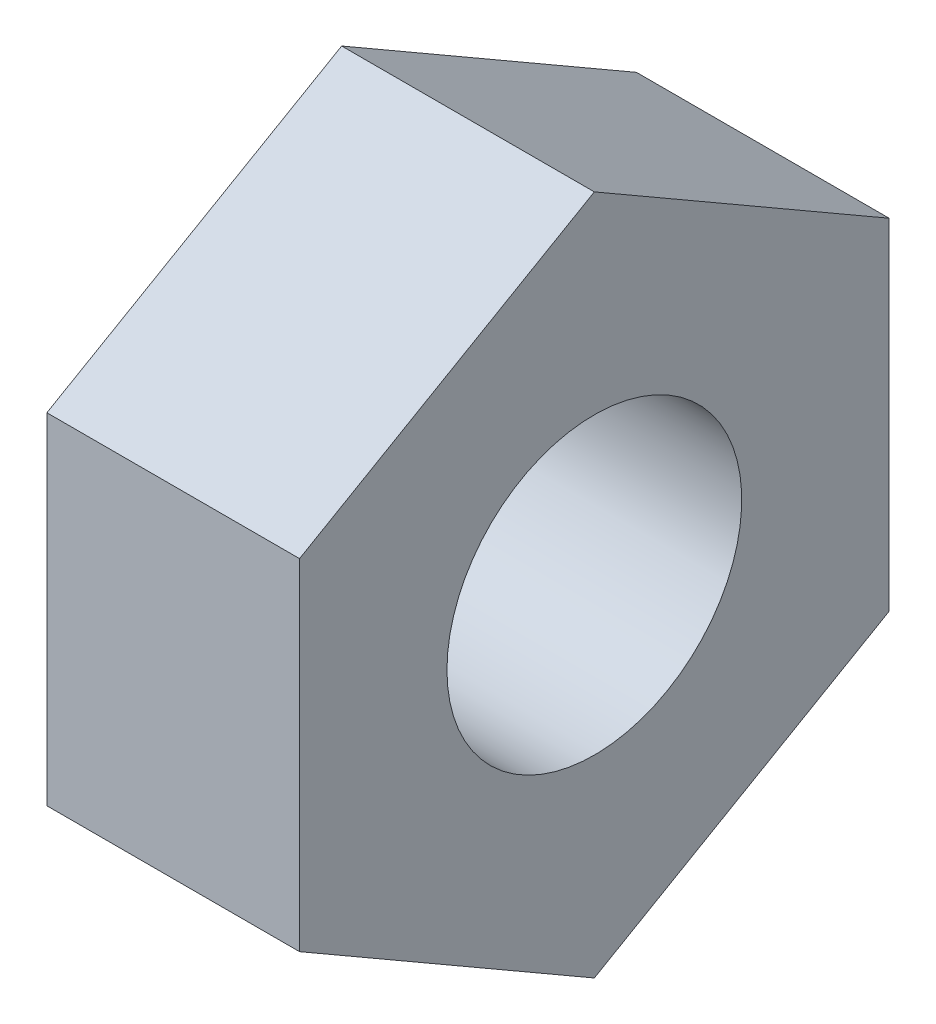
ISO-10303-21;
HEADER;
FILE_DESCRIPTION(('STEP AP214'),'2;1');
FILE_NAME('part.step','',(''),(''),'','','');
FILE_SCHEMA(('AUTOMOTIVE_DESIGN { 1 0 10303 214 1 1 1 1 }'));
ENDSEC;
DATA;
#1=APPLICATION_CONTEXT('core data for automotive mechanical design processes');
#2=APPLICATION_PROTOCOL_DEFINITION('international standard','automotive_design',2000,#1);
#3=PRODUCT_CONTEXT('',#1,'mechanical');
#4=PRODUCT('Part','Part','',(#3));
#5=PRODUCT_RELATED_PRODUCT_CATEGORY('part','',(#4));
#6=PRODUCT_DEFINITION_FORMATION('','',#4);
#7=PRODUCT_DEFINITION_CONTEXT('part definition',#1,'design');
#8=PRODUCT_DEFINITION('design','',#6,#7);
#9=PRODUCT_DEFINITION_SHAPE('','',#8);
#10=(LENGTH_UNIT() NAMED_UNIT(*) SI_UNIT(.MILLI.,.METRE.));
#11=(NAMED_UNIT(*) PLANE_ANGLE_UNIT() SI_UNIT($,.RADIAN.));
#12=(NAMED_UNIT(*) SI_UNIT($,.STERADIAN.) SOLID_ANGLE_UNIT());
#13=UNCERTAINTY_MEASURE_WITH_UNIT(LENGTH_MEASURE(1.E-05),#10,'distance_accuracy_value','');
#14=(GEOMETRIC_REPRESENTATION_CONTEXT(3) GLOBAL_UNCERTAINTY_ASSIGNED_CONTEXT((#13)) GLOBAL_UNIT_ASSIGNED_CONTEXT((#10,
#11,#12)) REPRESENTATION_CONTEXT('',''));
#15=CARTESIAN_POINT('',(0.,0.,0.));
#16=DIRECTION('',(0.,0.,1.));
#17=DIRECTION('',(1.,0.,0.));
#18=AXIS2_PLACEMENT_3D('',#15,#16,#17);
#19=CARTESIAN_POINT('',(3.,-4.04145188432738,0.));
#20=DIRECTION('',(0.,0.866025403784439,0.5));
#21=DIRECTION('',(0.,-0.5,0.866025403784439));
#22=AXIS2_PLACEMENT_3D('',#19,#20,#21);
#23=PLANE('',#22);
#24=DIRECTION('',(0.,0.5,-0.866025403784439));
#25=VECTOR('',#24,1.);
#26=CARTESIAN_POINT('',(0.,-4.04145188432738,0.));
#27=LINE('',#26,#25);
#28=CARTESIAN_POINT('',(0.,-4.04145188432738,0.));
#29=VERTEX_POINT('',#28);
#30=CARTESIAN_POINT('',(0.,-2.02072594216369,-3.5));
#31=VERTEX_POINT('',#30);
#32=EDGE_CURVE('E118',#29,#31,#27,.T.);
#33=ORIENTED_EDGE('',*,*,#32,.T.);
#34=DIRECTION('',(-1.,0.,0.));
#35=VECTOR('',#34,1.);
#36=CARTESIAN_POINT('',(3.,-2.02072594216369,-3.5));
#37=LINE('',#36,#35);
#38=CARTESIAN_POINT('',(3.,-2.02072594216369,-3.5));
#39=VERTEX_POINT('',#38);
#40=EDGE_CURVE('E11',#39,#31,#37,.T.);
#41=ORIENTED_EDGE('',*,*,#40,.F.);
#42=DIRECTION('',(0.,0.5,-0.866025403784439));
#43=VECTOR('',#42,1.);
#44=CARTESIAN_POINT('',(3.,-4.04145188432738,0.));
#45=LINE('',#44,#43);
#46=CARTESIAN_POINT('',(3.,-4.04145188432738,0.));
#47=VERTEX_POINT('',#46);
#48=EDGE_CURVE('E129',#47,#39,#45,.T.);
#49=ORIENTED_EDGE('',*,*,#48,.F.);
#50=DIRECTION('',(-1.,0.,0.));
#51=VECTOR('',#50,1.);
#52=CARTESIAN_POINT('',(3.,-4.04145188432738,0.));
#53=LINE('',#52,#51);
#54=EDGE_CURVE('E114',#47,#29,#53,.T.);
#55=ORIENTED_EDGE('',*,*,#54,.T.);
#56=EDGE_LOOP('',(#33,#41,#49,#55));
#57=FACE_BOUND('',#56,.T.);
#58=ADVANCED_FACE('F34',(#57),#23,.F.);
#59=CARTESIAN_POINT('',(3.,-2.02072594216369,-3.5));
#60=DIRECTION('',(0.,0.,1.));
#61=DIRECTION('',(0.,-1.,0.));
#62=AXIS2_PLACEMENT_3D('',#59,#60,#61);
#63=PLANE('',#62);
#64=DIRECTION('',(0.,1.,0.));
#65=VECTOR('',#64,1.);
#66=CARTESIAN_POINT('',(0.,-2.02072594216369,-3.5));
#67=LINE('',#66,#65);
#68=CARTESIAN_POINT('',(0.,2.02072594216369,-3.5));
#69=VERTEX_POINT('',#68);
#70=EDGE_CURVE('E121',#31,#69,#67,.T.);
#71=ORIENTED_EDGE('',*,*,#70,.T.);
#72=DIRECTION('',(-1.,0.,0.));
#73=VECTOR('',#72,1.);
#74=CARTESIAN_POINT('',(3.,2.02072594216369,-3.5));
#75=LINE('',#74,#73);
#76=CARTESIAN_POINT('',(3.,2.02072594216369,-3.5));
#77=VERTEX_POINT('',#76);
#78=EDGE_CURVE('E42',#77,#69,#75,.T.);
#79=ORIENTED_EDGE('',*,*,#78,.F.);
#80=DIRECTION('',(0.,1.,0.));
#81=VECTOR('',#80,1.);
#82=CARTESIAN_POINT('',(3.,-2.02072594216369,-3.5));
#83=LINE('',#82,#81);
#84=EDGE_CURVE('E87',#39,#77,#83,.T.);
#85=ORIENTED_EDGE('',*,*,#84,.F.);
#86=ORIENTED_EDGE('',*,*,#40,.T.);
#87=EDGE_LOOP('',(#71,#79,#85,#86));
#88=FACE_BOUND('',#87,.T.);
#89=ADVANCED_FACE('F154',(#88),#63,.F.);
#90=CARTESIAN_POINT('',(3.,2.02072594216369,-3.5));
#91=DIRECTION('',(0.,-0.866025403784439,0.5));
#92=DIRECTION('',(0.,-0.5,-0.866025403784439));
#93=AXIS2_PLACEMENT_3D('',#90,#91,#92);
#94=PLANE('',#93);
#95=DIRECTION('',(0.,0.5,0.866025403784439));
#96=VECTOR('',#95,1.);
#97=CARTESIAN_POINT('',(0.,2.02072594216369,-3.5));
#98=LINE('',#97,#96);
#99=CARTESIAN_POINT('',(0.,4.04145188432738,0.));
#100=VERTEX_POINT('',#99);
#101=EDGE_CURVE('E124',#69,#100,#98,.T.);
#102=ORIENTED_EDGE('',*,*,#101,.T.);
#103=DIRECTION('',(-1.,0.,0.));
#104=VECTOR('',#103,1.);
#105=CARTESIAN_POINT('',(3.,4.04145188432738,0.));
#106=LINE('',#105,#104);
#107=CARTESIAN_POINT('',(3.,4.04145188432738,0.));
#108=VERTEX_POINT('',#107);
#109=EDGE_CURVE('E109',#108,#100,#106,.T.);
#110=ORIENTED_EDGE('',*,*,#109,.F.);
#111=DIRECTION('',(0.,0.5,0.866025403784439));
#112=VECTOR('',#111,1.);
#113=CARTESIAN_POINT('',(3.,2.02072594216369,-3.5));
#114=LINE('',#113,#112);
#115=EDGE_CURVE('E100',#77,#108,#114,.T.);
#116=ORIENTED_EDGE('',*,*,#115,.F.);
#117=ORIENTED_EDGE('',*,*,#78,.T.);
#118=EDGE_LOOP('',(#102,#110,#116,#117));
#119=FACE_BOUND('',#118,.T.);
#120=ADVANCED_FACE('F135',(#119),#94,.F.);
#121=CARTESIAN_POINT('',(3.,4.04145188432738,0.));
#122=DIRECTION('',(0.,-0.866025403784439,-0.5));
#123=DIRECTION('',(0.,0.5,-0.866025403784439));
#124=AXIS2_PLACEMENT_3D('',#121,#122,#123);
#125=PLANE('',#124);
#126=DIRECTION('',(0.,-0.5,0.866025403784439));
#127=VECTOR('',#126,1.);
#128=CARTESIAN_POINT('',(0.,4.04145188432738,0.));
#129=LINE('',#128,#127);
#130=CARTESIAN_POINT('',(0.,2.02072594216369,3.5));
#131=VERTEX_POINT('',#130);
#132=EDGE_CURVE('E108',#100,#131,#129,.T.);
#133=ORIENTED_EDGE('',*,*,#132,.T.);
#134=DIRECTION('',(-1.,0.,0.));
#135=VECTOR('',#134,1.);
#136=CARTESIAN_POINT('',(3.,2.02072594216369,3.5));
#137=LINE('',#136,#135);
#138=CARTESIAN_POINT('',(3.,2.02072594216369,3.5));
#139=VERTEX_POINT('',#138);
#140=EDGE_CURVE('E105',#139,#131,#137,.T.);
#141=ORIENTED_EDGE('',*,*,#140,.F.);
#142=DIRECTION('',(0.,-0.5,0.866025403784439));
#143=VECTOR('',#142,1.);
#144=CARTESIAN_POINT('',(3.,4.04145188432738,0.));
#145=LINE('',#144,#143);
#146=EDGE_CURVE('E94',#108,#139,#145,.T.);
#147=ORIENTED_EDGE('',*,*,#146,.F.);
#148=ORIENTED_EDGE('',*,*,#109,.T.);
#149=EDGE_LOOP('',(#133,#141,#147,#148));
#150=FACE_BOUND('',#149,.T.);
#151=ADVANCED_FACE('F106',(#150),#125,.F.);
#152=CARTESIAN_POINT('',(3.,2.02072594216369,3.5));
#153=DIRECTION('',(0.,0.,-1.));
#154=DIRECTION('',(-1.,0.,0.));
#155=AXIS2_PLACEMENT_3D('',#152,#153,#154);
#156=PLANE('',#155);
#157=DIRECTION('',(0.,-1.,0.));
#158=VECTOR('',#157,1.);
#159=CARTESIAN_POINT('',(0.,2.02072594216369,3.5));
#160=LINE('',#159,#158);
#161=CARTESIAN_POINT('',(0.,-2.02072594216369,3.5));
#162=VERTEX_POINT('',#161);
#163=EDGE_CURVE('E73',#131,#162,#160,.T.);
#164=ORIENTED_EDGE('',*,*,#163,.T.);
#165=DIRECTION('',(-1.,0.,0.));
#166=VECTOR('',#165,1.);
#167=CARTESIAN_POINT('',(3.,-2.02072594216369,3.5));
#168=LINE('',#167,#166);
#169=CARTESIAN_POINT('',(3.,-2.02072594216369,3.5));
#170=VERTEX_POINT('',#169);
#171=EDGE_CURVE('E110',#170,#162,#168,.T.);
#172=ORIENTED_EDGE('',*,*,#171,.F.);
#173=DIRECTION('',(0.,-1.,0.));
#174=VECTOR('',#173,1.);
#175=CARTESIAN_POINT('',(3.,2.02072594216369,3.5));
#176=LINE('',#175,#174);
#177=EDGE_CURVE('E98',#139,#170,#176,.T.);
#178=ORIENTED_EDGE('',*,*,#177,.F.);
#179=ORIENTED_EDGE('',*,*,#140,.T.);
#180=EDGE_LOOP('',(#164,#172,#178,#179));
#181=FACE_BOUND('',#180,.T.);
#182=ADVANCED_FACE('F112',(#181),#156,.F.);
#183=CARTESIAN_POINT('',(3.,-2.02072594216369,3.5));
#184=DIRECTION('',(0.,0.866025403784438,-0.5));
#185=DIRECTION('',(0.,0.5,0.866025403784439));
#186=AXIS2_PLACEMENT_3D('',#183,#184,#185);
#187=PLANE('',#186);
#188=DIRECTION('',(0.,-0.5,-0.866025403784439));
#189=VECTOR('',#188,1.);
#190=CARTESIAN_POINT('',(0.,-2.02072594216369,3.5));
#191=LINE('',#190,#189);
#192=EDGE_CURVE('E79',#162,#29,#191,.T.);
#193=ORIENTED_EDGE('',*,*,#192,.T.);
#194=ORIENTED_EDGE('',*,*,#54,.F.);
#195=DIRECTION('',(0.,-0.5,-0.866025403784439));
#196=VECTOR('',#195,1.);
#197=CARTESIAN_POINT('',(3.,-2.02072594216369,3.5));
#198=LINE('',#197,#196);
#199=EDGE_CURVE('E50',#170,#47,#198,.T.);
#200=ORIENTED_EDGE('',*,*,#199,.F.);
#201=ORIENTED_EDGE('',*,*,#171,.T.);
#202=EDGE_LOOP('',(#193,#194,#200,#201));
#203=FACE_BOUND('',#202,.T.);
#204=ADVANCED_FACE('F142',(#203),#187,.F.);
#205=CARTESIAN_POINT('',(3.,0.,0.));
#206=DIRECTION('',(1.,0.,0.));
#207=DIRECTION('',(0.,0.,-1.));
#208=AXIS2_PLACEMENT_3D('',#205,#206,#207);
#209=PLANE('',#208);
#210=CARTESIAN_POINT('',(3.,0.,0.));
#211=DIRECTION('',(-1.,0.,0.));
#212=DIRECTION('',(0.,0.,1.));
#213=AXIS2_PLACEMENT_3D('',#210,#211,#212);
#214=CIRCLE('',#213,1.75);
#215=CARTESIAN_POINT('',(3.,0.,1.75));
#216=VERTEX_POINT('',#215);
#217=EDGE_CURVE('E122',#216,#216,#214,.T.);
#218=ORIENTED_EDGE('',*,*,#217,.T.);
#219=EDGE_LOOP('',(#218));
#220=FACE_BOUND('',#219,.T.);
#221=ORIENTED_EDGE('',*,*,#48,.T.);
#222=ORIENTED_EDGE('',*,*,#84,.T.);
#223=ORIENTED_EDGE('',*,*,#115,.T.);
#224=ORIENTED_EDGE('',*,*,#146,.T.);
#225=ORIENTED_EDGE('',*,*,#177,.T.);
#226=ORIENTED_EDGE('',*,*,#199,.T.);
#227=EDGE_LOOP('',(#221,#222,#223,#224,#225,#226));
#228=FACE_BOUND('',#227,.T.);
#229=ADVANCED_FACE('F96',(#220,#228),#209,.T.);
#230=CARTESIAN_POINT('',(0.,0.,0.));
#231=DIRECTION('',(1.,0.,0.));
#232=DIRECTION('',(0.,0.,-1.));
#233=AXIS2_PLACEMENT_3D('',#230,#231,#232);
#234=PLANE('',#233);
#235=CARTESIAN_POINT('',(0.,0.,0.));
#236=DIRECTION('',(-1.,0.,0.));
#237=DIRECTION('',(0.,0.,1.));
#238=AXIS2_PLACEMENT_3D('',#235,#236,#237);
#239=CIRCLE('',#238,1.75);
#240=CARTESIAN_POINT('',(0.,0.,1.75));
#241=VERTEX_POINT('',#240);
#242=EDGE_CURVE('E209',#241,#241,#239,.T.);
#243=ORIENTED_EDGE('',*,*,#242,.F.);
#244=EDGE_LOOP('',(#243));
#245=FACE_BOUND('',#244,.T.);
#246=ORIENTED_EDGE('',*,*,#32,.F.);
#247=ORIENTED_EDGE('',*,*,#192,.F.);
#248=ORIENTED_EDGE('',*,*,#163,.F.);
#249=ORIENTED_EDGE('',*,*,#132,.F.);
#250=ORIENTED_EDGE('',*,*,#101,.F.);
#251=ORIENTED_EDGE('',*,*,#70,.F.);
#252=EDGE_LOOP('',(#246,#247,#248,#249,#250,#251));
#253=FACE_BOUND('',#252,.T.);
#254=ADVANCED_FACE('F138',(#245,#253),#234,.F.);
#255=CARTESIAN_POINT('',(3.,0.,0.));
#256=DIRECTION('',(-1.,0.,0.));
#257=DIRECTION('',(0.,0.,1.));
#258=AXIS2_PLACEMENT_3D('',#255,#256,#257);
#259=CYLINDRICAL_SURFACE('',#258,1.75);
#260=ORIENTED_EDGE('',*,*,#217,.F.);
#261=EDGE_LOOP('',(#260));
#262=FACE_BOUND('',#261,.T.);
#263=ORIENTED_EDGE('',*,*,#242,.T.);
#264=EDGE_LOOP('',(#263));
#265=FACE_BOUND('',#264,.T.);
#266=ADVANCED_FACE('F191',(#262,#265),#259,.F.);
#267=CLOSED_SHELL('',(#58,#89,#120,#151,#182,#204,#229,#254,#266));
#268=MANIFOLD_SOLID_BREP('B2',#267);
#269=ADVANCED_BREP_SHAPE_REPRESENTATION('',(#18,#268),#14);
#270=SHAPE_DEFINITION_REPRESENTATION(#9,#269);
ENDSEC;
END-ISO-10303-21;
